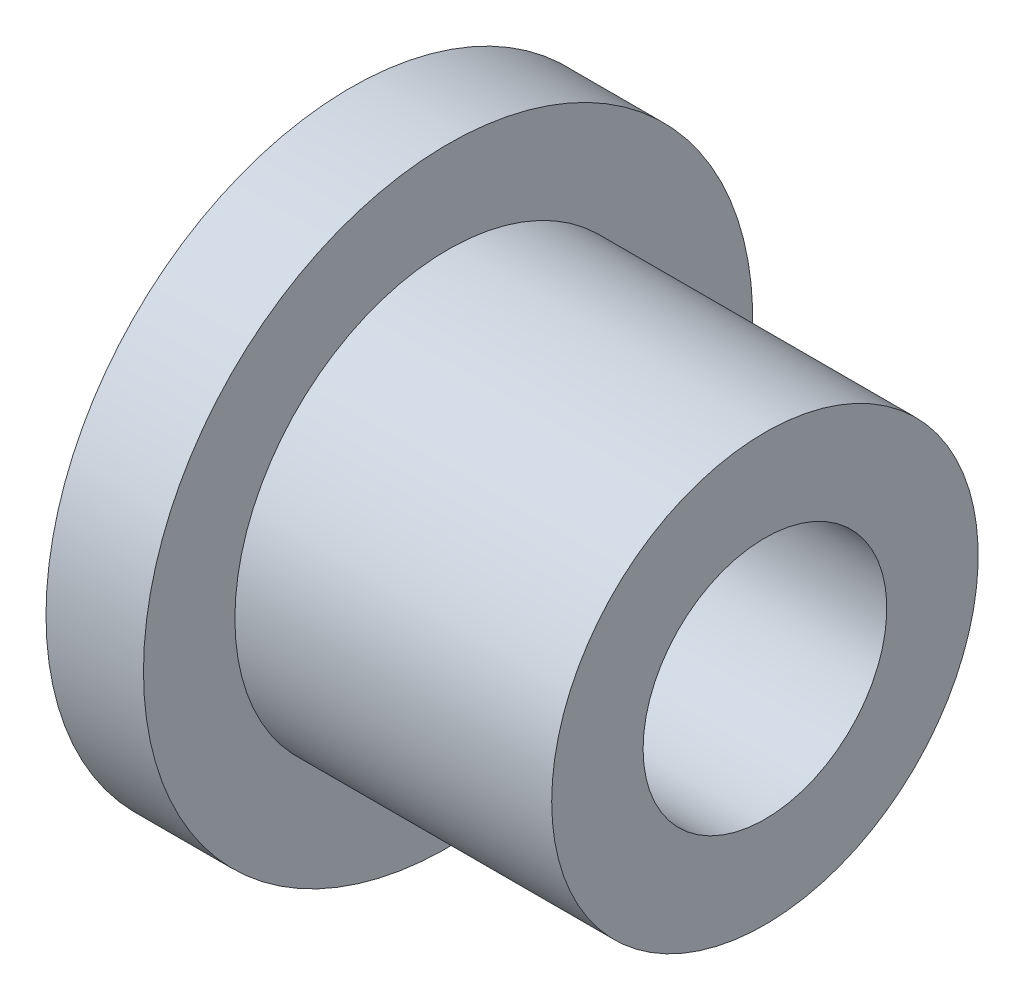
ISO-10303-21;
HEADER;
FILE_DESCRIPTION(('STEP AP214'),'2;1');
FILE_NAME('part.step','',(''),(''),'','','');
FILE_SCHEMA(('AUTOMOTIVE_DESIGN { 1 0 10303 214 1 1 1 1 }'));
ENDSEC;
DATA;
#1=APPLICATION_CONTEXT('core data for automotive mechanical design processes');
#2=APPLICATION_PROTOCOL_DEFINITION('international standard','automotive_design',2000,#1);
#3=PRODUCT_CONTEXT('',#1,'mechanical');
#4=PRODUCT('Part','Part','',(#3));
#5=PRODUCT_RELATED_PRODUCT_CATEGORY('part','',(#4));
#6=PRODUCT_DEFINITION_FORMATION('','',#4);
#7=PRODUCT_DEFINITION_CONTEXT('part definition',#1,'design');
#8=PRODUCT_DEFINITION('design','',#6,#7);
#9=PRODUCT_DEFINITION_SHAPE('','',#8);
#10=(LENGTH_UNIT() NAMED_UNIT(*) SI_UNIT(.MILLI.,.METRE.));
#11=(NAMED_UNIT(*) PLANE_ANGLE_UNIT() SI_UNIT($,.RADIAN.));
#12=(NAMED_UNIT(*) SI_UNIT($,.STERADIAN.) SOLID_ANGLE_UNIT());
#13=UNCERTAINTY_MEASURE_WITH_UNIT(LENGTH_MEASURE(1.E-05),#10,'distance_accuracy_value','');
#14=(GEOMETRIC_REPRESENTATION_CONTEXT(3) GLOBAL_UNCERTAINTY_ASSIGNED_CONTEXT((#13)) GLOBAL_UNIT_ASSIGNED_CONTEXT((#10,
#11,#12)) REPRESENTATION_CONTEXT('',''));
#15=CARTESIAN_POINT('',(0.,0.,0.));
#16=DIRECTION('',(0.,0.,1.));
#17=DIRECTION('',(1.,0.,0.));
#18=AXIS2_PLACEMENT_3D('',#15,#16,#17);
#19=CARTESIAN_POINT('',(2.12469935465433,13.1320775684836,0.));
#20=DIRECTION('',(-1.,0.,0.));
#21=DIRECTION('',(0.,0.,1.));
#22=AXIS2_PLACEMENT_3D('',#19,#20,#21);
#23=PLANE('',#22);
#24=CARTESIAN_POINT('',(2.12469935465433,-4.36792243151637,0.));
#25=DIRECTION('',(-1.,0.,0.));
#26=DIRECTION('',(0.,0.,1.));
#27=AXIS2_PLACEMENT_3D('',#24,#25,#26);
#28=CIRCLE('',#27,17.5);
#29=CARTESIAN_POINT('',(2.12469935465433,-4.36792243151637,17.5));
#30=VERTEX_POINT('',#29);
#31=EDGE_CURVE('E54',#30,#30,#28,.T.);
#32=ORIENTED_EDGE('',*,*,#31,.F.);
#33=EDGE_LOOP('',(#32));
#34=FACE_BOUND('',#33,.T.);
#35=CARTESIAN_POINT('',(2.12469935465432,-4.36792243151637,0.));
#36=DIRECTION('',(-1.,0.,0.));
#37=DIRECTION('',(0.,0.,1.));
#38=AXIS2_PLACEMENT_3D('',#35,#36,#37);
#39=CIRCLE('',#38,10.);
#40=CARTESIAN_POINT('',(2.12469935465432,-4.36792243151637,10.));
#41=VERTEX_POINT('',#40);
#42=EDGE_CURVE('E10',#41,#41,#39,.T.);
#43=ORIENTED_EDGE('',*,*,#42,.T.);
#44=EDGE_LOOP('',(#43));
#45=FACE_BOUND('',#44,.T.);
#46=ADVANCED_FACE('F32',(#34,#45),#23,.F.);
#47=CARTESIAN_POINT('',(-24.9161169718763,-4.36792243151637,0.));
#48=DIRECTION('',(-1.,0.,0.));
#49=DIRECTION('',(0.,0.,1.));
#50=AXIS2_PLACEMENT_3D('',#47,#48,#49);
#51=CYLINDRICAL_SURFACE('',#50,10.);
#52=ORIENTED_EDGE('',*,*,#42,.F.);
#53=EDGE_LOOP('',(#52));
#54=FACE_BOUND('',#53,.T.);
#55=CARTESIAN_POINT('',(-31.8753006453457,-4.36792243151637,0.));
#56=DIRECTION('',(-1.,0.,0.));
#57=DIRECTION('',(0.,0.,1.));
#58=AXIS2_PLACEMENT_3D('',#55,#56,#57);
#59=CIRCLE('',#58,10.);
#60=CARTESIAN_POINT('',(-31.8753006453457,-4.36792243151637,10.));
#61=VERTEX_POINT('',#60);
#62=EDGE_CURVE('E38',#61,#61,#59,.T.);
#63=ORIENTED_EDGE('',*,*,#62,.T.);
#64=EDGE_LOOP('',(#63));
#65=FACE_BOUND('',#64,.T.);
#66=ADVANCED_FACE('F61',(#54,#65),#51,.F.);
#67=CARTESIAN_POINT('',(-31.8753006453457,5.63207756848363,0.));
#68=DIRECTION('',(1.,0.,0.));
#69=DIRECTION('',(0.,0.,-1.));
#70=AXIS2_PLACEMENT_3D('',#67,#68,#69);
#71=PLANE('',#70);
#72=ORIENTED_EDGE('',*,*,#62,.F.);
#73=EDGE_LOOP('',(#72));
#74=FACE_BOUND('',#73,.T.);
#75=CARTESIAN_POINT('',(-31.8753006453457,-4.36792243151637,0.));
#76=DIRECTION('',(-1.,0.,0.));
#77=DIRECTION('',(0.,0.,1.));
#78=AXIS2_PLACEMENT_3D('',#75,#76,#77);
#79=CIRCLE('',#78,25.);
#80=CARTESIAN_POINT('',(-31.8753006453457,-4.36792243151637,25.));
#81=VERTEX_POINT('',#80);
#82=EDGE_CURVE('E42',#81,#81,#79,.T.);
#83=ORIENTED_EDGE('',*,*,#82,.T.);
#84=EDGE_LOOP('',(#83));
#85=FACE_BOUND('',#84,.T.);
#86=ADVANCED_FACE('F65',(#74,#85),#71,.F.);
#87=CARTESIAN_POINT('',(-24.9161169718763,-4.36792243151637,0.));
#88=DIRECTION('',(-1.,0.,0.));
#89=DIRECTION('',(0.,0.,1.));
#90=AXIS2_PLACEMENT_3D('',#87,#88,#89);
#91=CYLINDRICAL_SURFACE('',#90,25.);
#92=ORIENTED_EDGE('',*,*,#82,.F.);
#93=EDGE_LOOP('',(#92));
#94=FACE_BOUND('',#93,.T.);
#95=CARTESIAN_POINT('',(-23.8753006453457,-4.36792243151637,0.));
#96=DIRECTION('',(-1.,0.,0.));
#97=DIRECTION('',(0.,0.,1.));
#98=AXIS2_PLACEMENT_3D('',#95,#96,#97);
#99=CIRCLE('',#98,25.);
#100=CARTESIAN_POINT('',(-23.8753006453457,-4.36792243151637,25.));
#101=VERTEX_POINT('',#100);
#102=EDGE_CURVE('E46',#101,#101,#99,.T.);
#103=ORIENTED_EDGE('',*,*,#102,.T.);
#104=EDGE_LOOP('',(#103));
#105=FACE_BOUND('',#104,.T.);
#106=ADVANCED_FACE('F70',(#94,#105),#91,.T.);
#107=CARTESIAN_POINT('',(-23.8753006453457,20.6320775684836,0.));
#108=DIRECTION('',(-1.,0.,0.));
#109=DIRECTION('',(0.,0.,1.));
#110=AXIS2_PLACEMENT_3D('',#107,#108,#109);
#111=PLANE('',#110);
#112=ORIENTED_EDGE('',*,*,#102,.F.);
#113=EDGE_LOOP('',(#112));
#114=FACE_BOUND('',#113,.T.);
#115=CARTESIAN_POINT('',(-23.8753006453457,-4.36792243151637,0.));
#116=DIRECTION('',(-1.,0.,0.));
#117=DIRECTION('',(0.,0.,1.));
#118=AXIS2_PLACEMENT_3D('',#115,#116,#117);
#119=CIRCLE('',#118,17.5);
#120=CARTESIAN_POINT('',(-23.8753006453457,-4.36792243151637,17.5));
#121=VERTEX_POINT('',#120);
#122=EDGE_CURVE('E51',#121,#121,#119,.T.);
#123=ORIENTED_EDGE('',*,*,#122,.T.);
#124=EDGE_LOOP('',(#123));
#125=FACE_BOUND('',#124,.T.);
#126=ADVANCED_FACE('F76',(#114,#125),#111,.F.);
#127=CARTESIAN_POINT('',(-24.9161169718763,-4.36792243151637,0.));
#128=DIRECTION('',(-1.,0.,0.));
#129=DIRECTION('',(0.,0.,1.));
#130=AXIS2_PLACEMENT_3D('',#127,#128,#129);
#131=CYLINDRICAL_SURFACE('',#130,17.5);
#132=ORIENTED_EDGE('',*,*,#122,.F.);
#133=EDGE_LOOP('',(#132));
#134=FACE_BOUND('',#133,.T.);
#135=ORIENTED_EDGE('',*,*,#31,.T.);
#136=EDGE_LOOP('',(#135));
#137=FACE_BOUND('',#136,.T.);
#138=ADVANCED_FACE('F58',(#134,#137),#131,.T.);
#139=CLOSED_SHELL('',(#46,#66,#86,#106,#126,#138));
#140=MANIFOLD_SOLID_BREP('B2',#139);
#141=ADVANCED_BREP_SHAPE_REPRESENTATION('',(#18,#140),#14);
#142=SHAPE_DEFINITION_REPRESENTATION(#9,#141);
ENDSEC;
END-ISO-10303-21;
